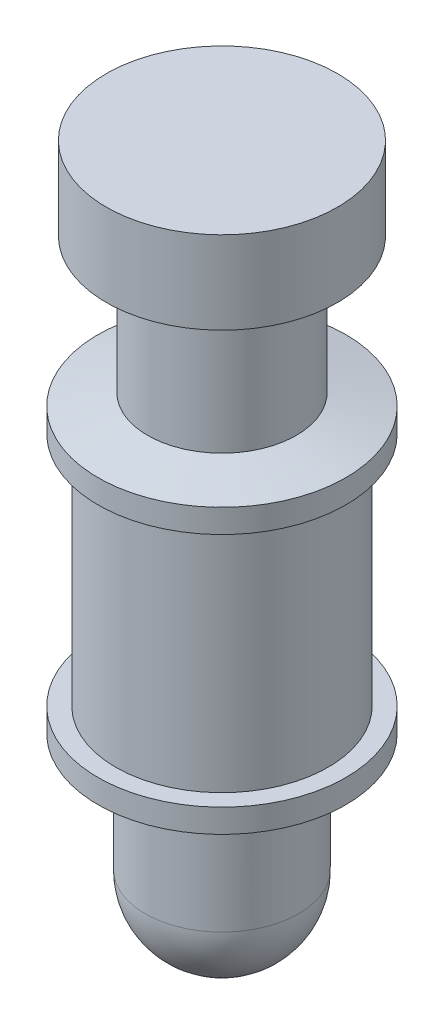
ISO-10303-21;
HEADER;
FILE_DESCRIPTION(('STEP AP214'),'2;1');
FILE_NAME('part.step','',(''),(''),'','','');
FILE_SCHEMA(('AUTOMOTIVE_DESIGN { 1 0 10303 214 1 1 1 1 }'));
ENDSEC;
DATA;
#1=APPLICATION_CONTEXT('core data for automotive mechanical design processes');
#2=APPLICATION_PROTOCOL_DEFINITION('international standard','automotive_design',2000,#1);
#3=PRODUCT_CONTEXT('',#1,'mechanical');
#4=PRODUCT('Part','Part','',(#3));
#5=PRODUCT_RELATED_PRODUCT_CATEGORY('part','',(#4));
#6=PRODUCT_DEFINITION_FORMATION('','',#4);
#7=PRODUCT_DEFINITION_CONTEXT('part definition',#1,'design');
#8=PRODUCT_DEFINITION('design','',#6,#7);
#9=PRODUCT_DEFINITION_SHAPE('','',#8);
#10=(LENGTH_UNIT() NAMED_UNIT(*) SI_UNIT(.MILLI.,.METRE.));
#11=(NAMED_UNIT(*) PLANE_ANGLE_UNIT() SI_UNIT($,.RADIAN.));
#12=(NAMED_UNIT(*) SI_UNIT($,.STERADIAN.) SOLID_ANGLE_UNIT());
#13=UNCERTAINTY_MEASURE_WITH_UNIT(LENGTH_MEASURE(1.E-05),#10,'distance_accuracy_value','');
#14=(GEOMETRIC_REPRESENTATION_CONTEXT(3) GLOBAL_UNCERTAINTY_ASSIGNED_CONTEXT((#13)) GLOBAL_UNIT_ASSIGNED_CONTEXT((#10,
#11,#12)) REPRESENTATION_CONTEXT('',''));
#15=CARTESIAN_POINT('',(0.,0.,0.));
#16=DIRECTION('',(0.,0.,1.));
#17=DIRECTION('',(1.,0.,0.));
#18=AXIS2_PLACEMENT_3D('',#15,#16,#17);
#19=CARTESIAN_POINT('',(0.,3.5,0.));
#20=DIRECTION('',(0.,1.,0.));
#21=DIRECTION('',(0.,0.,1.));
#22=AXIS2_PLACEMENT_3D('',#19,#20,#21);
#23=PLANE('',#22);
#24=CARTESIAN_POINT('',(0.,3.5,0.));
#25=DIRECTION('',(0.,-1.,0.));
#26=DIRECTION('',(0.,0.,-1.));
#27=AXIS2_PLACEMENT_3D('',#24,#25,#26);
#28=CIRCLE('',#27,9.8);
#29=CARTESIAN_POINT('',(0.,3.5,-9.8));
#30=VERTEX_POINT('',#29);
#31=EDGE_CURVE('E10',#30,#30,#28,.T.);
#32=ORIENTED_EDGE('',*,*,#31,.F.);
#33=EDGE_LOOP('',(#32));
#34=FACE_BOUND('',#33,.T.);
#35=ADVANCED_FACE('F31',(#34),#23,.T.);
#36=CARTESIAN_POINT('',(0.,-54.,0.));
#37=DIRECTION('',(0.,-1.,0.));
#38=DIRECTION('',(0.,0.,-1.));
#39=AXIS2_PLACEMENT_3D('',#36,#37,#38);
#40=CYLINDRICAL_SURFACE('',#39,9.8);
#41=ORIENTED_EDGE('',*,*,#31,.T.);
#42=EDGE_LOOP('',(#41));
#43=FACE_BOUND('',#42,.T.);
#44=CARTESIAN_POINT('',(0.,-3.5,0.));
#45=DIRECTION('',(0.,-1.,0.));
#46=DIRECTION('',(0.,0.,-1.));
#47=AXIS2_PLACEMENT_3D('',#44,#45,#46);
#48=CIRCLE('',#47,9.8);
#49=CARTESIAN_POINT('',(0.,-3.5,-9.8));
#50=VERTEX_POINT('',#49);
#51=EDGE_CURVE('E37',#50,#50,#48,.T.);
#52=ORIENTED_EDGE('',*,*,#51,.F.);
#53=EDGE_LOOP('',(#52));
#54=FACE_BOUND('',#53,.T.);
#55=ADVANCED_FACE('F91',(#43,#54),#40,.T.);
#56=CARTESIAN_POINT('',(0.,-5.,0.));
#57=DIRECTION('',(0.,1.,0.));
#58=DIRECTION('',(0.,0.,1.));
#59=AXIS2_PLACEMENT_3D('',#56,#57,#58);
#60=CONICAL_SURFACE('',#59,6.3,1.16590454050981);
#61=ORIENTED_EDGE('',*,*,#51,.T.);
#62=EDGE_LOOP('',(#61));
#63=FACE_BOUND('',#62,.T.);
#64=CARTESIAN_POINT('',(0.,-5.,0.));
#65=DIRECTION('',(0.,-1.,0.));
#66=DIRECTION('',(0.,0.,-1.));
#67=AXIS2_PLACEMENT_3D('',#64,#65,#66);
#68=CIRCLE('',#67,6.3);
#69=CARTESIAN_POINT('',(0.,-5.,-6.3));
#70=VERTEX_POINT('',#69);
#71=EDGE_CURVE('E41',#70,#70,#68,.T.);
#72=ORIENTED_EDGE('',*,*,#71,.F.);
#73=EDGE_LOOP('',(#72));
#74=FACE_BOUND('',#73,.T.);
#75=ADVANCED_FACE('F96',(#63,#74),#60,.T.);
#76=CARTESIAN_POINT('',(0.,-54.,0.));
#77=DIRECTION('',(0.,-1.,0.));
#78=DIRECTION('',(0.,0.,-1.));
#79=AXIS2_PLACEMENT_3D('',#76,#77,#78);
#80=CYLINDRICAL_SURFACE('',#79,6.3);
#81=ORIENTED_EDGE('',*,*,#71,.T.);
#82=EDGE_LOOP('',(#81));
#83=FACE_BOUND('',#82,.T.);
#84=CARTESIAN_POINT('',(0.,-15.,0.));
#85=DIRECTION('',(0.,-1.,0.));
#86=DIRECTION('',(0.,0.,-1.));
#87=AXIS2_PLACEMENT_3D('',#84,#85,#86);
#88=CIRCLE('',#87,6.3);
#89=CARTESIAN_POINT('',(0.,-15.,-6.3));
#90=VERTEX_POINT('',#89);
#91=EDGE_CURVE('E45',#90,#90,#88,.T.);
#92=ORIENTED_EDGE('',*,*,#91,.F.);
#93=EDGE_LOOP('',(#92));
#94=FACE_BOUND('',#93,.T.);
#95=ADVANCED_FACE('F100',(#83,#94),#80,.T.);
#96=CARTESIAN_POINT('',(0.,-16.,0.));
#97=DIRECTION('',(0.,-1.,0.));
#98=DIRECTION('',(0.,0.,-1.));
#99=AXIS2_PLACEMENT_3D('',#96,#97,#98);
#100=CONICAL_SURFACE('',#99,10.5,1.337053145926);
#101=ORIENTED_EDGE('',*,*,#91,.T.);
#102=EDGE_LOOP('',(#101));
#103=FACE_BOUND('',#102,.T.);
#104=CARTESIAN_POINT('',(0.,-16.,0.));
#105=DIRECTION('',(0.,-1.,0.));
#106=DIRECTION('',(0.,0.,-1.));
#107=AXIS2_PLACEMENT_3D('',#104,#105,#106);
#108=CIRCLE('',#107,10.5);
#109=CARTESIAN_POINT('',(0.,-16.,-10.5));
#110=VERTEX_POINT('',#109);
#111=EDGE_CURVE('E50',#110,#110,#108,.T.);
#112=ORIENTED_EDGE('',*,*,#111,.F.);
#113=EDGE_LOOP('',(#112));
#114=FACE_BOUND('',#113,.T.);
#115=ADVANCED_FACE('F106',(#103,#114),#100,.T.);
#116=CARTESIAN_POINT('',(0.,-54.,0.));
#117=DIRECTION('',(0.,-1.,0.));
#118=DIRECTION('',(0.,0.,-1.));
#119=AXIS2_PLACEMENT_3D('',#116,#117,#118);
#120=CYLINDRICAL_SURFACE('',#119,10.5);
#121=ORIENTED_EDGE('',*,*,#111,.T.);
#122=EDGE_LOOP('',(#121));
#123=FACE_BOUND('',#122,.T.);
#124=CARTESIAN_POINT('',(0.,-18.,0.));
#125=DIRECTION('',(0.,-1.,0.));
#126=DIRECTION('',(0.,0.,-1.));
#127=AXIS2_PLACEMENT_3D('',#124,#125,#126);
#128=CIRCLE('',#127,10.5);
#129=CARTESIAN_POINT('',(0.,-18.,-10.5));
#130=VERTEX_POINT('',#129);
#131=EDGE_CURVE('E53',#130,#130,#128,.T.);
#132=ORIENTED_EDGE('',*,*,#131,.F.);
#133=EDGE_LOOP('',(#132));
#134=FACE_BOUND('',#133,.T.);
#135=ADVANCED_FACE('F110',(#123,#134),#120,.T.);
#136=CARTESIAN_POINT('',(10.5,-18.,0.));
#137=DIRECTION('',(0.,-1.,0.));
#138=DIRECTION('',(0.,0.,-1.));
#139=AXIS2_PLACEMENT_3D('',#136,#137,#138);
#140=PLANE('',#139);
#141=ORIENTED_EDGE('',*,*,#131,.T.);
#142=EDGE_LOOP('',(#141));
#143=FACE_BOUND('',#142,.T.);
#144=CARTESIAN_POINT('',(0.,-18.,0.));
#145=DIRECTION('',(0.,-1.,0.));
#146=DIRECTION('',(0.,0.,-1.));
#147=AXIS2_PLACEMENT_3D('',#144,#145,#146);
#148=CIRCLE('',#147,9.);
#149=CARTESIAN_POINT('',(0.,-18.,-9.));
#150=VERTEX_POINT('',#149);
#151=EDGE_CURVE('E56',#150,#150,#148,.T.);
#152=ORIENTED_EDGE('',*,*,#151,.F.);
#153=EDGE_LOOP('',(#152));
#154=FACE_BOUND('',#153,.T.);
#155=ADVANCED_FACE('F114',(#143,#154),#140,.T.);
#156=CARTESIAN_POINT('',(0.,-54.,0.));
#157=DIRECTION('',(0.,-1.,0.));
#158=DIRECTION('',(0.,0.,-1.));
#159=AXIS2_PLACEMENT_3D('',#156,#157,#158);
#160=CYLINDRICAL_SURFACE('',#159,9.);
#161=ORIENTED_EDGE('',*,*,#151,.T.);
#162=EDGE_LOOP('',(#161));
#163=FACE_BOUND('',#162,.T.);
#164=CARTESIAN_POINT('',(0.,-38.,0.));
#165=DIRECTION('',(0.,-1.,0.));
#166=DIRECTION('',(0.,0.,-1.));
#167=AXIS2_PLACEMENT_3D('',#164,#165,#166);
#168=CIRCLE('',#167,9.);
#169=CARTESIAN_POINT('',(0.,-38.,-9.));
#170=VERTEX_POINT('',#169);
#171=EDGE_CURVE('E59',#170,#170,#168,.T.);
#172=ORIENTED_EDGE('',*,*,#171,.F.);
#173=EDGE_LOOP('',(#172));
#174=FACE_BOUND('',#173,.T.);
#175=ADVANCED_FACE('F118',(#163,#174),#160,.T.);
#176=CARTESIAN_POINT('',(9.,-38.,0.));
#177=DIRECTION('',(0.,1.,0.));
#178=DIRECTION('',(0.,0.,1.));
#179=AXIS2_PLACEMENT_3D('',#176,#177,#178);
#180=PLANE('',#179);
#181=ORIENTED_EDGE('',*,*,#171,.T.);
#182=EDGE_LOOP('',(#181));
#183=FACE_BOUND('',#182,.T.);
#184=CARTESIAN_POINT('',(0.,-38.,0.));
#185=DIRECTION('',(0.,-1.,0.));
#186=DIRECTION('',(0.,0.,-1.));
#187=AXIS2_PLACEMENT_3D('',#184,#185,#186);
#188=CIRCLE('',#187,10.5);
#189=CARTESIAN_POINT('',(0.,-38.,-10.5));
#190=VERTEX_POINT('',#189);
#191=EDGE_CURVE('E62',#190,#190,#188,.T.);
#192=ORIENTED_EDGE('',*,*,#191,.F.);
#193=EDGE_LOOP('',(#192));
#194=FACE_BOUND('',#193,.T.);
#195=ADVANCED_FACE('F122',(#183,#194),#180,.T.);
#196=CARTESIAN_POINT('',(0.,-54.,0.));
#197=DIRECTION('',(0.,-1.,0.));
#198=DIRECTION('',(0.,0.,-1.));
#199=AXIS2_PLACEMENT_3D('',#196,#197,#198);
#200=CYLINDRICAL_SURFACE('',#199,10.5);
#201=ORIENTED_EDGE('',*,*,#191,.T.);
#202=EDGE_LOOP('',(#201));
#203=FACE_BOUND('',#202,.T.);
#204=CARTESIAN_POINT('',(0.,-40.,0.));
#205=DIRECTION('',(0.,-1.,0.));
#206=DIRECTION('',(0.,0.,-1.));
#207=AXIS2_PLACEMENT_3D('',#204,#205,#206);
#208=CIRCLE('',#207,10.5);
#209=CARTESIAN_POINT('',(0.,-40.,-10.5));
#210=VERTEX_POINT('',#209);
#211=EDGE_CURVE('E65',#210,#210,#208,.T.);
#212=ORIENTED_EDGE('',*,*,#211,.F.);
#213=EDGE_LOOP('',(#212));
#214=FACE_BOUND('',#213,.T.);
#215=ADVANCED_FACE('F87',(#203,#214),#200,.T.);
#216=CARTESIAN_POINT('',(0.,-41.,0.));
#217=DIRECTION('',(0.,1.,0.));
#218=DIRECTION('',(0.,0.,1.));
#219=AXIS2_PLACEMENT_3D('',#216,#217,#218);
#220=CONICAL_SURFACE('',#219,6.5,1.32581766366803);
#221=ORIENTED_EDGE('',*,*,#211,.T.);
#222=EDGE_LOOP('',(#221));
#223=FACE_BOUND('',#222,.T.);
#224=CARTESIAN_POINT('',(0.,-41.,0.));
#225=DIRECTION('',(0.,-1.,0.));
#226=DIRECTION('',(0.,0.,-1.));
#227=AXIS2_PLACEMENT_3D('',#224,#225,#226);
#228=CIRCLE('',#227,6.5);
#229=CARTESIAN_POINT('',(0.,-41.,-6.5));
#230=VERTEX_POINT('',#229);
#231=EDGE_CURVE('E68',#230,#230,#228,.T.);
#232=ORIENTED_EDGE('',*,*,#231,.F.);
#233=EDGE_LOOP('',(#232));
#234=FACE_BOUND('',#233,.T.);
#235=ADVANCED_FACE('F79',(#223,#234),#220,.T.);
#236=CARTESIAN_POINT('',(0.,-54.,0.));
#237=DIRECTION('',(0.,-1.,0.));
#238=DIRECTION('',(0.,0.,-1.));
#239=AXIS2_PLACEMENT_3D('',#236,#237,#238);
#240=CYLINDRICAL_SURFACE('',#239,6.5);
#241=ORIENTED_EDGE('',*,*,#231,.T.);
#242=EDGE_LOOP('',(#241));
#243=FACE_BOUND('',#242,.T.);
#244=CARTESIAN_POINT('',(0.,-50.,0.));
#245=DIRECTION('',(0.,-1.,0.));
#246=DIRECTION('',(0.,0.,-1.));
#247=AXIS2_PLACEMENT_3D('',#244,#245,#246);
#248=CIRCLE('',#247,6.5);
#249=CARTESIAN_POINT('',(0.,-50.,-6.5));
#250=VERTEX_POINT('',#249);
#251=EDGE_CURVE('E71',#250,#250,#248,.T.);
#252=ORIENTED_EDGE('',*,*,#251,.F.);
#253=EDGE_LOOP('',(#252));
#254=FACE_BOUND('',#253,.T.);
#255=ADVANCED_FACE('F77',(#243,#254),#240,.T.);
#256=CARTESIAN_POINT('',(0.,-50.,0.));
#257=DIRECTION('',(0.,-1.,0.));
#258=DIRECTION('',(1.,0.,0.));
#259=AXIS2_PLACEMENT_3D('',#256,#257,#258);
#260=SPHERICAL_SURFACE('',#259,6.5);
#261=ORIENTED_EDGE('',*,*,#251,.T.);
#262=EDGE_LOOP('',(#261));
#263=FACE_BOUND('',#262,.T.);
#264=ADVANCED_FACE('F75',(#263),#260,.T.);
#265=CLOSED_SHELL('',(#35,#55,#75,#95,#115,#135,#155,#175,#195,#215,#235,#255,#264));
#266=MANIFOLD_SOLID_BREP('B2',#265);
#267=ADVANCED_BREP_SHAPE_REPRESENTATION('',(#18,#266),#14);
#268=SHAPE_DEFINITION_REPRESENTATION(#9,#267);
ENDSEC;
END-ISO-10303-21;
